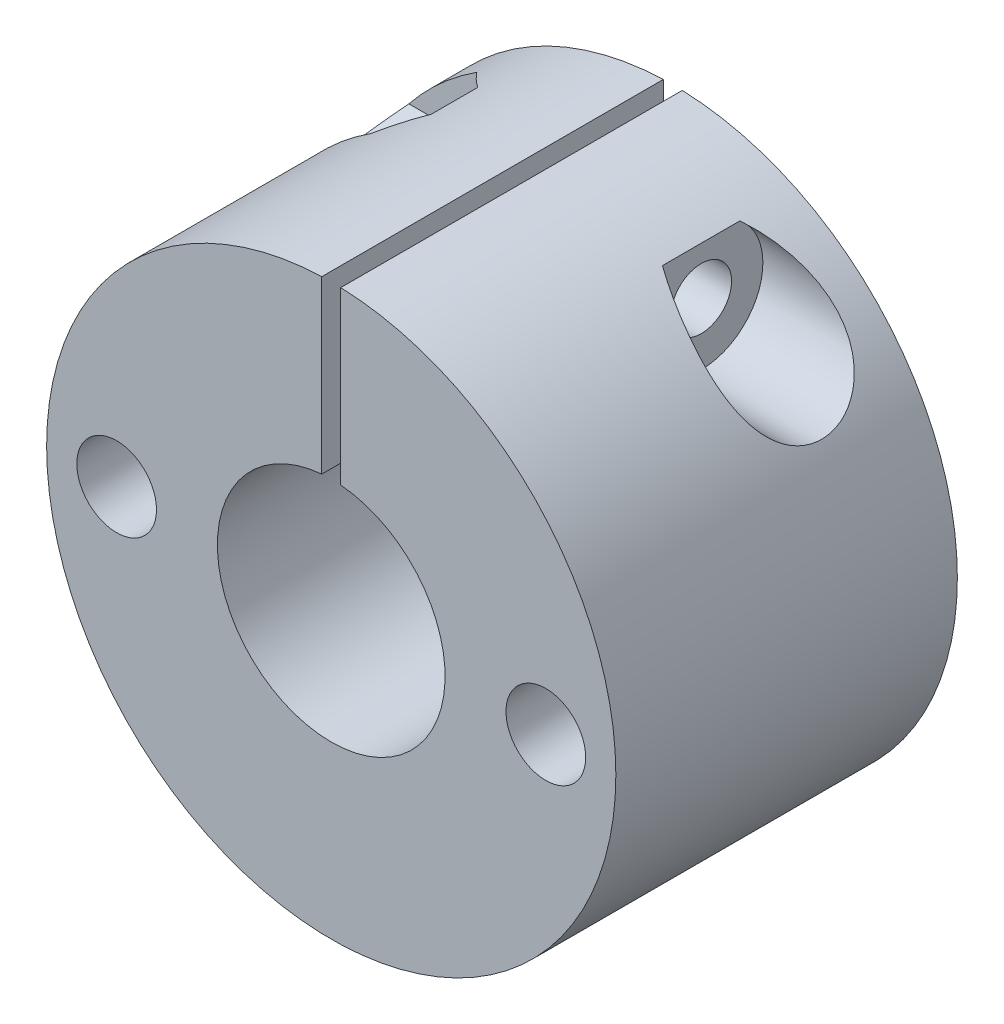
ISO-10303-21;
HEADER;
FILE_DESCRIPTION(('STEP AP214'),'2;1');
FILE_NAME('part.step','',(''),(''),'','','');
FILE_SCHEMA(('AUTOMOTIVE_DESIGN { 1 0 10303 214 1 1 1 1 }'));
ENDSEC;
DATA;
#1=APPLICATION_CONTEXT('core data for automotive mechanical design processes');
#2=APPLICATION_PROTOCOL_DEFINITION('international standard','automotive_design',2000,#1);
#3=PRODUCT_CONTEXT('',#1,'mechanical');
#4=PRODUCT('Part','Part','',(#3));
#5=PRODUCT_RELATED_PRODUCT_CATEGORY('part','',(#4));
#6=PRODUCT_DEFINITION_FORMATION('','',#4);
#7=PRODUCT_DEFINITION_CONTEXT('part definition',#1,'design');
#8=PRODUCT_DEFINITION('design','',#6,#7);
#9=PRODUCT_DEFINITION_SHAPE('','',#8);
#10=(LENGTH_UNIT() NAMED_UNIT(*) SI_UNIT(.MILLI.,.METRE.));
#11=(NAMED_UNIT(*) PLANE_ANGLE_UNIT() SI_UNIT($,.RADIAN.));
#12=(NAMED_UNIT(*) SI_UNIT($,.STERADIAN.) SOLID_ANGLE_UNIT());
#13=UNCERTAINTY_MEASURE_WITH_UNIT(LENGTH_MEASURE(1.E-05),#10,'distance_accuracy_value','');
#14=(GEOMETRIC_REPRESENTATION_CONTEXT(3) GLOBAL_UNCERTAINTY_ASSIGNED_CONTEXT((#13)) GLOBAL_UNIT_ASSIGNED_CONTEXT((#10,
#11,#12)) REPRESENTATION_CONTEXT('',''));
#15=CARTESIAN_POINT('',(0.,0.,0.));
#16=DIRECTION('',(0.,0.,1.));
#17=DIRECTION('',(1.,0.,0.));
#18=AXIS2_PLACEMENT_3D('',#15,#16,#17);
#19=CARTESIAN_POINT('',(0.,0.,10.));
#20=DIRECTION('',(0.,0.,-1.));
#21=DIRECTION('',(-1.,0.,0.));
#22=AXIS2_PLACEMENT_3D('',#19,#20,#21);
#23=CYLINDRICAL_SURFACE('',#22,15.);
#24=CARTESIAN_POINT('',(0.,0.,18.4381211149221));
#25=DIRECTION('',(0.,-0.866025403784439,-0.5));
#26=DIRECTION('',(0.,0.5,-0.866025403784439));
#27=AXIS2_PLACEMENT_3D('',#24,#25,#26);
#28=ELLIPSE('',#27,30.,15.);
#29=CARTESIAN_POINT('',(-12.8376646487421,7.75850284310304,5.));
#30=VERTEX_POINT('',#29);
#31=CARTESIAN_POINT('',(-11.7093043154738,9.375083596834,2.2));
#32=VERTEX_POINT('',#31);
#33=EDGE_CURVE('E41',#30,#32,#28,.T.);
#34=ORIENTED_EDGE('',*,*,#33,.T.);
#35=CARTESIAN_POINT('',(0.,0.,2.2));
#36=DIRECTION('',(0.,0.,-1.));
#37=DIRECTION('',(0.,1.,0.));
#38=AXIS2_PLACEMENT_3D('',#35,#36,#37);
#39=CIRCLE('',#38,15.);
#40=CARTESIAN_POINT('',(-8.12601719109666,12.6082451042959,2.2));
#41=VERTEX_POINT('',#40);
#42=EDGE_CURVE('E11',#32,#41,#39,.T.);
#43=ORIENTED_EDGE('',*,*,#42,.T.);
#44=CARTESIAN_POINT('',(0.,0.,-19.638121114922));
#45=DIRECTION('',(0.,0.866025403784438,-0.5));
#46=DIRECTION('',(0.,-0.5,-0.866025403784438));
#47=AXIS2_PLACEMENT_3D('',#44,#45,#46);
#48=ELLIPSE('',#47,30.,15.);
#49=CARTESIAN_POINT('',(-6.5,13.5185058345958,3.77661783301413));
#50=VERTEX_POINT('',#49);
#51=EDGE_CURVE('E221',#41,#50,#48,.T.);
#52=ORIENTED_EDGE('',*,*,#51,.T.);
#53=DIRECTION('',(0.,0.,-1.));
#54=VECTOR('',#53,1.);
#55=CARTESIAN_POINT('',(-6.5,13.5185058345958,10.));
#56=LINE('',#55,#54);
#57=CARTESIAN_POINT('',(-6.5,13.5185058345958,6.22338216698587));
#58=VERTEX_POINT('',#57);
#59=EDGE_CURVE('E186',#50,#58,#56,.F.);
#60=ORIENTED_EDGE('',*,*,#59,.T.);
#61=CARTESIAN_POINT('',(0.,0.,29.6381211149221));
#62=DIRECTION('',(0.,0.866025403784439,0.5));
#63=DIRECTION('',(0.,0.5,-0.866025403784439));
#64=AXIS2_PLACEMENT_3D('',#61,#62,#63);
#65=ELLIPSE('',#64,30.,15.);
#66=CARTESIAN_POINT('',(-8.12601719109666,12.6082451042959,7.8));
#67=VERTEX_POINT('',#66);
#68=EDGE_CURVE('E322',#58,#67,#65,.T.);
#69=ORIENTED_EDGE('',*,*,#68,.T.);
#70=CARTESIAN_POINT('',(0.,0.,7.8));
#71=DIRECTION('',(0.,0.,1.));
#72=DIRECTION('',(1.,0.,0.));
#73=AXIS2_PLACEMENT_3D('',#70,#71,#72);
#74=CIRCLE('',#73,15.);
#75=CARTESIAN_POINT('',(-11.7093043154738,9.375083596834,7.8));
#76=VERTEX_POINT('',#75);
#77=EDGE_CURVE('E320',#67,#76,#74,.T.);
#78=ORIENTED_EDGE('',*,*,#77,.T.);
#79=CARTESIAN_POINT('',(0.,0.,-8.43812111492206));
#80=DIRECTION('',(0.,-0.866025403784439,0.5));
#81=DIRECTION('',(0.,-0.5,-0.866025403784439));
#82=AXIS2_PLACEMENT_3D('',#79,#80,#81);
#83=ELLIPSE('',#82,30.,15.);
#84=EDGE_CURVE('E317',#76,#30,#83,.T.);
#85=ORIENTED_EDGE('',*,*,#84,.T.);
#86=EDGE_LOOP('',(#34,#43,#52,#60,#69,#78,#85));
#87=FACE_BOUND('',#86,.T.);
#88=DIRECTION('',(0.,0.,-1.));
#89=VECTOR('',#88,1.);
#90=CARTESIAN_POINT('',(6.5,13.5185058345958,10.));
#91=LINE('',#90,#89);
#92=CARTESIAN_POINT('',(6.5,13.5185058345958,7.04391098499443));
#93=VERTEX_POINT('',#92);
#94=CARTESIAN_POINT('',(6.5,13.5185058345958,2.95608901500557));
#95=VERTEX_POINT('',#94);
#96=EDGE_CURVE('E191',#93,#95,#91,.T.);
#97=ORIENTED_EDGE('',*,*,#96,.T.);
#98=CARTESIAN_POINT('',(6.5,13.5185058345958,2.95608901500557));
#99=CARTESIAN_POINT('',(6.60077995397167,13.4700535111463,2.89622151010847));
#100=CARTESIAN_POINT('',(6.70208644627659,13.4199509129455,2.8386018661959));
#101=CARTESIAN_POINT('',(6.90537761246059,13.3164834397401,2.72766532047725));
#102=CARTESIAN_POINT('',(7.00736223675518,13.2631188009656,2.67434810774526));
#103=CARTESIAN_POINT('',(7.21176967172565,13.1530937930471,2.57175450440019));
#104=CARTESIAN_POINT('',(7.31419285684764,13.0964296190281,2.52248294333907));
#105=CARTESIAN_POINT('',(7.51907997014724,12.9798818003815,2.42801287585828));
#106=CARTESIAN_POINT('',(7.62154389935371,12.9199980685512,2.38281447985034));
#107=CARTESIAN_POINT('',(7.93087980884181,12.7341821527837,2.25241462875838));
#108=CARTESIAN_POINT('',(8.13748046823632,12.603271592114,2.17351631200674));
#109=CARTESIAN_POINT('',(8.54801294702669,12.3285215546223,2.03368147863605));
#110=CARTESIAN_POINT('',(8.75194622040524,12.1846894891085,1.97273475039122));
#111=CARTESIAN_POINT('',(9.09464950279762,11.9297202200354,1.88635398124806));
#112=CARTESIAN_POINT('',(9.23452420221066,11.8218039504727,1.85575314665935));
#113=CARTESIAN_POINT('',(9.51155850133452,11.600074353212,1.80543189761769));
#114=CARTESIAN_POINT('',(9.64871819761472,11.4862612357806,1.78571109550228));
#115=CARTESIAN_POINT('',(9.91914441417635,11.2535442465628,1.75845874184467));
#116=CARTESIAN_POINT('',(10.0524224785325,11.1346587872467,1.75088641046633));
#117=CARTESIAN_POINT('',(10.3146370129245,10.892208616726,1.74925940827744));
#118=CARTESIAN_POINT('',(10.4435747735191,10.768645320081,1.7552006826105));
#119=CARTESIAN_POINT('',(10.755618397432,10.4587180957925,1.78863912334436));
#120=CARTESIAN_POINT('',(10.9357555610439,10.2700895295993,1.82494208798895));
#121=CARTESIAN_POINT('',(11.1942575585868,9.985247755581,1.9081723538056));
#122=CARTESIAN_POINT('',(11.2784667822413,9.88999319864192,1.94070726442509));
#123=CARTESIAN_POINT('',(11.4424690134127,9.69977649303123,2.01604234667242));
#124=CARTESIAN_POINT('',(11.522262971634,9.60481428560171,2.05884029777087));
#125=CARTESIAN_POINT('',(11.7217903474067,9.36144124043637,2.18346925330629));
#126=CARTESIAN_POINT('',(11.8378225033953,9.21400076758558,2.27353746119259));
#127=CARTESIAN_POINT('',(12.0003008380298,9.00005066507423,2.43020967027421));
#128=CARTESIAN_POINT('',(12.0525545534217,8.92990338353914,2.4860611308862));
#129=CARTESIAN_POINT('',(12.1528895219876,8.79286381422359,2.60500663394133));
#130=CARTESIAN_POINT('',(12.2009729065485,8.7259698714866,2.66809693797299));
#131=CARTESIAN_POINT('',(12.2930765080924,8.59573743607299,2.80208112197654));
#132=CARTESIAN_POINT('',(12.3370534804884,8.5324390531847,2.87304384628227));
#133=CARTESIAN_POINT('',(12.420073208734,8.41113430365239,3.02197551119575));
#134=CARTESIAN_POINT('',(12.4591185367247,8.35312518277624,3.09994076296406));
#135=CARTESIAN_POINT('',(12.5319846680426,8.24340338816984,3.26242479152513));
#136=CARTESIAN_POINT('',(12.5658076228899,8.19168812335837,3.34694084783836));
#137=CARTESIAN_POINT('',(12.6279825162501,8.09551355241083,3.5219033091721));
#138=CARTESIAN_POINT('',(12.6563355540382,8.05105278863401,3.61234851772082));
#139=CARTESIAN_POINT('',(12.7035494977617,7.97630758765642,3.78444792462952));
#140=CARTESIAN_POINT('',(12.7231954676874,7.94489777227231,3.86540046722918));
#141=CARTESIAN_POINT('',(12.7582694939701,7.88845131792142,4.03037739966574));
#142=CARTESIAN_POINT('',(12.7736981411689,7.86341378623954,4.1144013573293));
#143=CARTESIAN_POINT('',(12.8002512409679,7.8201162053009,4.28480626856938));
#144=CARTESIAN_POINT('',(12.8113777665728,7.80185289201702,4.37118606543489));
#145=CARTESIAN_POINT('',(12.8292808259275,7.77237668591578,4.54555568873136));
#146=CARTESIAN_POINT('',(12.8360576390547,7.76116334028763,4.6335454113851));
#147=CARTESIAN_POINT('',(12.8489029983896,7.73989863124004,4.88145406250534));
#148=CARTESIAN_POINT('',(12.850039900976,7.7379994857407,5.04243653087509));
#149=CARTESIAN_POINT('',(12.8380092992168,7.75793960802013,5.36225602170284));
#150=CARTESIAN_POINT('',(12.8248455755823,7.77977260164368,5.5210935999764));
#151=CARTESIAN_POINT('',(12.7848759859573,7.84527661894923,5.82882997558445));
#152=CARTESIAN_POINT('',(12.7583646062099,7.8884758952998,5.97786794159066));
#153=CARTESIAN_POINT('',(12.6922942070394,7.99434394350173,6.26574334892559));
#154=CARTESIAN_POINT('',(12.6527343262246,8.05701400069324,6.40458011608607));
#155=CARTESIAN_POINT('',(12.5595115615957,8.20160417448285,6.67401069625711));
#156=CARTESIAN_POINT('',(12.505373343997,8.28416078485868,6.80409663014154));
#157=CARTESIAN_POINT('',(12.3847807615201,8.46338317364435,7.04772867073237));
#158=CARTESIAN_POINT('',(12.318322794249,8.56005307713249,7.16126992225306));
#159=CARTESIAN_POINT('',(12.1672280235717,8.77366967281356,7.38090691962466));
#160=CARTESIAN_POINT('',(12.0814470729571,8.89167529816192,7.48517744856051));
#161=CARTESIAN_POINT('',(11.8982014038141,9.13542815515895,7.67217476194751));
#162=CARTESIAN_POINT('',(11.8007296508007,9.26118002545131,7.75488847950088));
#163=CARTESIAN_POINT('',(11.6234496914707,9.48207761270871,7.88013402847819));
#164=CARTESIAN_POINT('',(11.5459211060164,9.57638032348254,7.92749224798169));
#165=CARTESIAN_POINT('',(11.3861854048312,9.76576255074424,8.01171118578004));
#166=CARTESIAN_POINT('',(11.3039766465506,9.86084232979945,8.04856819098562));
#167=CARTESIAN_POINT('',(11.1354125672287,10.0508078215784,8.11245023206344));
#168=CARTESIAN_POINT('',(11.0490524331475,10.1456931692477,8.13946352813617));
#169=CARTESIAN_POINT('',(10.8727972195146,10.3343582909763,8.18431362944683));
#170=CARTESIAN_POINT('',(10.7829011672122,10.4281377514458,8.20214789020409));
#171=CARTESIAN_POINT('',(10.5650919347078,10.6494725449636,8.23454112014992));
#172=CARTESIAN_POINT('',(10.4357866377049,10.7762302326248,8.24523963300513));
#173=CARTESIAN_POINT('',(10.1724566573497,11.0251529418463,8.25221339378782));
#174=CARTESIAN_POINT('',(10.0384303089628,11.1473163110161,8.2484835015585));
#175=CARTESIAN_POINT('',(9.76608785967312,11.3866815714186,8.22814862174923));
#176=CARTESIAN_POINT('',(9.62775731060085,11.5038626963075,8.21149443852779));
#177=CARTESIAN_POINT('',(9.34810684919636,11.7322423858804,8.16663627051442));
#178=CARTESIAN_POINT('',(9.20678684807925,11.8434407725323,8.1384319422322));
#179=CARTESIAN_POINT('',(8.85390671956257,12.1110698671338,8.05570740568714));
#180=CARTESIAN_POINT('',(8.64096599176621,12.2638042398071,7.99505155251428));
#181=CARTESIAN_POINT('',(8.21189406901484,12.5551624555191,7.85380792640738));
#182=CARTESIAN_POINT('',(7.99576070078221,12.6937761267096,7.77320592659775));
#183=CARTESIAN_POINT('',(7.6721871459187,12.8900432592521,7.6390938181006));
#184=CARTESIAN_POINT('',(7.56511092058473,12.9531591330083,7.59252449729816));
#185=CARTESIAN_POINT('',(7.35096505679336,13.0758761437704,7.49493639288319));
#186=CARTESIAN_POINT('',(7.24389541823547,13.1354773791167,7.44391773386344));
#187=CARTESIAN_POINT('',(7.03023226470404,13.2510585617706,7.33748017667258));
#188=CARTESIAN_POINT('',(6.92363827901506,13.3070437505683,7.28206791916836));
#189=CARTESIAN_POINT('',(6.71117235021071,13.4154549932104,7.16655740792555));
#190=CARTESIAN_POINT('',(6.60530045912946,13.4678807929526,7.10645882028998));
#191=CARTESIAN_POINT('',(6.49999999999974,13.5185058345959,7.04391098499603));
#192=B_SPLINE_CURVE_WITH_KNOTS('',3,(#98,#99,#100,#101,#102,#103,#104,#105,#106,#107,#108,#109,
#110,#111,#112,#113,#114,#115,#116,#117,#118,#119,#120,#121,#122,#123,#124,#125,#126,#127,#128,
#129,#130,#131,#132,#133,#134,#135,#136,#137,#138,#139,#140,#141,#142,#143,#144,#145,#146,#147,
#148,#149,#150,#151,#152,#153,#154,#155,#156,#157,#158,#159,#160,#161,#162,#163,#164,#165,#166,
#167,#168,#169,#170,#171,#172,#173,#174,#175,#176,#177,#178,#179,#180,#181,#182,#183,#184,#185,
#186,#187,#188,#189,#190,#191),.UNSPECIFIED.,.F.,.F.,(4,2,2,2,2,2,2,2,2,2,2,2,2,2,2,2,2,2,2,2,2,
2,2,2,2,2,2,2,2,2,2,2,2,2,2,2,2,2,2,2,2,2,2,2,2,2,4),(0.,0.380469307460688,0.760911094689918,
1.14180062925206,1.52270048552397,2.29271460233827,3.06228985273649,3.59978439050786,
4.13725977577012,4.67292716660796,5.20843384772543,5.99519145562376,6.38849513697244,
6.78171379910472,7.40317447686845,7.71420740408708,8.02508041910718,8.33892576644932,
8.65260674316072,8.96615814236348,9.27964646215907,9.5463639396275,9.81304403113572,
10.0795954605276,10.3461297678981,10.8265336849873,11.3068106267623,11.776927461797,
12.2470753376248,12.7349425728362,13.2229526899802,13.7588716623548,14.2951147362835,
14.6874488599373,15.0799215360308,15.4728607625287,15.8659088554232,16.4092605180387,
16.9528057689203,17.4984302061521,18.0440708709123,18.8497245157184,19.6559544692675,
20.0540505212815,20.4521354291707,20.8496297228535,21.2471523635839),.UNSPECIFIED.);
#193=EDGE_CURVE('E209',#95,#93,#192,.T.);
#194=ORIENTED_EDGE('',*,*,#193,.T.);
#195=EDGE_LOOP('',(#97,#194));
#196=FACE_BOUND('',#195,.T.);
#197=CARTESIAN_POINT('',(0.,0.,0.));
#198=DIRECTION('',(0.,0.,1.));
#199=DIRECTION('',(1.,0.,0.));
#200=AXIS2_PLACEMENT_3D('',#197,#198,#199);
#201=CIRCLE('',#200,15.);
#202=CARTESIAN_POINT('',(-0.5,14.9916643505649,0.));
#203=VERTEX_POINT('',#202);
#204=CARTESIAN_POINT('',(0.5,14.9916643505649,0.));
#205=VERTEX_POINT('',#204);
#206=EDGE_CURVE('E123',#203,#205,#201,.T.);
#207=ORIENTED_EDGE('',*,*,#206,.T.);
#208=DIRECTION('',(0.,0.,-1.));
#209=VECTOR('',#208,1.);
#210=CARTESIAN_POINT('',(0.5,14.9916643505649,10.));
#211=LINE('',#210,#209);
#212=CARTESIAN_POINT('',(0.5,14.9916643505649,18.));
#213=VERTEX_POINT('',#212);
#214=EDGE_CURVE('E117',#213,#205,#211,.T.);
#215=ORIENTED_EDGE('',*,*,#214,.F.);
#216=CARTESIAN_POINT('',(0.,0.,18.));
#217=DIRECTION('',(0.,0.,1.));
#218=DIRECTION('',(1.,0.,0.));
#219=AXIS2_PLACEMENT_3D('',#216,#217,#218);
#220=CIRCLE('',#219,15.);
#221=CARTESIAN_POINT('',(-0.5,14.9916643505649,18.));
#222=VERTEX_POINT('',#221);
#223=EDGE_CURVE('E121',#222,#213,#220,.T.);
#224=ORIENTED_EDGE('',*,*,#223,.F.);
#225=DIRECTION('',(0.,0.,-1.));
#226=VECTOR('',#225,1.);
#227=CARTESIAN_POINT('',(-0.5,14.9916643505649,10.));
#228=LINE('',#227,#226);
#229=EDGE_CURVE('E127',#203,#222,#228,.F.);
#230=ORIENTED_EDGE('',*,*,#229,.F.);
#231=EDGE_LOOP('',(#207,#215,#224,#230));
#232=FACE_BOUND('',#231,.T.);
#233=ADVANCED_FACE('F33',(#87,#196,#232),#23,.T.);
#234=CARTESIAN_POINT('',(0.,0.,0.));
#235=DIRECTION('',(0.,0.,1.));
#236=DIRECTION('',(1.,0.,0.));
#237=AXIS2_PLACEMENT_3D('',#234,#235,#236);
#238=PLANE('',#237);
#239=CARTESIAN_POINT('',(11.31,0.,0.));
#240=DIRECTION('',(0.,0.,1.));
#241=DIRECTION('',(1.,0.,0.));
#242=AXIS2_PLACEMENT_3D('',#239,#240,#241);
#243=CIRCLE('',#242,2.1);
#244=CARTESIAN_POINT('',(13.41,0.,0.));
#245=VERTEX_POINT('',#244);
#246=EDGE_CURVE('E154',#245,#245,#243,.F.);
#247=ORIENTED_EDGE('',*,*,#246,.F.);
#248=EDGE_LOOP('',(#247));
#249=FACE_BOUND('',#248,.T.);
#250=CARTESIAN_POINT('',(-11.31,0.,0.));
#251=DIRECTION('',(0.,0.,1.));
#252=DIRECTION('',(1.,0.,0.));
#253=AXIS2_PLACEMENT_3D('',#250,#251,#252);
#254=CIRCLE('',#253,2.1);
#255=CARTESIAN_POINT('',(-9.21,0.,0.));
#256=VERTEX_POINT('',#255);
#257=EDGE_CURVE('E153',#256,#256,#254,.F.);
#258=ORIENTED_EDGE('',*,*,#257,.F.);
#259=EDGE_LOOP('',(#258));
#260=FACE_BOUND('',#259,.T.);
#261=CARTESIAN_POINT('',(0.,0.,0.));
#262=DIRECTION('',(0.,0.,1.));
#263=DIRECTION('',(1.,0.,0.));
#264=AXIS2_PLACEMENT_3D('',#261,#262,#263);
#265=CIRCLE('',#264,6.);
#266=CARTESIAN_POINT('',(-0.499999999999999,5.9791303715507,0.));
#267=VERTEX_POINT('',#266);
#268=CARTESIAN_POINT('',(0.500000000000001,5.9791303715507,0.));
#269=VERTEX_POINT('',#268);
#270=EDGE_CURVE('E205',#267,#269,#265,.T.);
#271=ORIENTED_EDGE('',*,*,#270,.T.);
#272=DIRECTION('',(0.,-1.,0.));
#273=VECTOR('',#272,1.);
#274=CARTESIAN_POINT('',(0.5,18.,0.));
#275=LINE('',#274,#273);
#276=EDGE_CURVE('E126',#205,#269,#275,.T.);
#277=ORIENTED_EDGE('',*,*,#276,.F.);
#278=ORIENTED_EDGE('',*,*,#206,.F.);
#279=DIRECTION('',(0.,1.,0.));
#280=VECTOR('',#279,1.);
#281=CARTESIAN_POINT('',(-0.5,18.,0.));
#282=LINE('',#281,#280);
#283=EDGE_CURVE('E203',#267,#203,#282,.T.);
#284=ORIENTED_EDGE('',*,*,#283,.F.);
#285=EDGE_LOOP('',(#271,#277,#278,#284));
#286=FACE_BOUND('',#285,.T.);
#287=ADVANCED_FACE('F245',(#249,#260,#286),#238,.F.);
#288=CARTESIAN_POINT('',(0.,0.,10.));
#289=DIRECTION('',(0.,0.,-1.));
#290=DIRECTION('',(-1.,0.,0.));
#291=AXIS2_PLACEMENT_3D('',#288,#289,#290);
#292=CYLINDRICAL_SURFACE('',#291,6.);
#293=DIRECTION('',(0.,0.,-1.));
#294=VECTOR('',#293,1.);
#295=CARTESIAN_POINT('',(0.500000000000001,5.9791303715507,10.));
#296=LINE('',#295,#294);
#297=CARTESIAN_POINT('',(0.500000000000001,5.9791303715507,18.));
#298=VERTEX_POINT('',#297);
#299=EDGE_CURVE('E133',#298,#269,#296,.T.);
#300=ORIENTED_EDGE('',*,*,#299,.T.);
#301=ORIENTED_EDGE('',*,*,#270,.F.);
#302=DIRECTION('',(0.,0.,-1.));
#303=VECTOR('',#302,1.);
#304=CARTESIAN_POINT('',(-0.499999999999999,5.9791303715507,10.));
#305=LINE('',#304,#303);
#306=CARTESIAN_POINT('',(-0.499999999999998,5.9791303715507,18.));
#307=VERTEX_POINT('',#306);
#308=EDGE_CURVE('E198',#267,#307,#305,.F.);
#309=ORIENTED_EDGE('',*,*,#308,.T.);
#310=CARTESIAN_POINT('',(0.,0.,18.));
#311=DIRECTION('',(0.,0.,-1.));
#312=DIRECTION('',(1.,0.,0.));
#313=AXIS2_PLACEMENT_3D('',#310,#311,#312);
#314=CIRCLE('',#313,6.);
#315=EDGE_CURVE('E137',#298,#307,#314,.T.);
#316=ORIENTED_EDGE('',*,*,#315,.F.);
#317=EDGE_LOOP('',(#300,#301,#309,#316));
#318=FACE_BOUND('',#317,.T.);
#319=ADVANCED_FACE('F239',(#318),#292,.F.);
#320=CARTESIAN_POINT('',(-0.5,18.,-0.000999999999999265));
#321=DIRECTION('',(-1.,0.,0.));
#322=DIRECTION('',(0.,-1.,0.));
#323=AXIS2_PLACEMENT_3D('',#320,#321,#322);
#324=PLANE('',#323);
#325=CARTESIAN_POINT('',(-0.5,10.9916643505649,5.));
#326=DIRECTION('',(-1.,0.,0.));
#327=DIRECTION('',(0.,-1.,0.));
#328=AXIS2_PLACEMENT_3D('',#325,#326,#327);
#329=CIRCLE('',#328,1.6);
#330=CARTESIAN_POINT('',(-0.5,9.39166435056495,5.));
#331=VERTEX_POINT('',#330);
#332=EDGE_CURVE('E195',#331,#331,#329,.F.);
#333=ORIENTED_EDGE('',*,*,#332,.F.);
#334=EDGE_LOOP('',(#333));
#335=FACE_BOUND('',#334,.T.);
#336=ORIENTED_EDGE('',*,*,#229,.T.);
#337=DIRECTION('',(0.,1.,0.));
#338=VECTOR('',#337,1.);
#339=CARTESIAN_POINT('',(-0.499999999999998,5.9791303715507,18.));
#340=LINE('',#339,#338);
#341=EDGE_CURVE('E143',#307,#222,#340,.T.);
#342=ORIENTED_EDGE('',*,*,#341,.F.);
#343=ORIENTED_EDGE('',*,*,#308,.F.);
#344=ORIENTED_EDGE('',*,*,#283,.T.);
#345=EDGE_LOOP('',(#336,#342,#343,#344));
#346=FACE_BOUND('',#345,.T.);
#347=ADVANCED_FACE('F236',(#335,#346),#324,.F.);
#348=CARTESIAN_POINT('',(0.5,18.,-0.000999999999999265));
#349=DIRECTION('',(1.,0.,0.));
#350=DIRECTION('',(0.,1.,0.));
#351=AXIS2_PLACEMENT_3D('',#348,#349,#350);
#352=PLANE('',#351);
#353=CARTESIAN_POINT('',(0.5,10.9916643505649,5.));
#354=DIRECTION('',(1.,0.,0.));
#355=DIRECTION('',(0.,1.,0.));
#356=AXIS2_PLACEMENT_3D('',#353,#354,#355);
#357=CIRCLE('',#356,1.6);
#358=CARTESIAN_POINT('',(0.5,12.5916643505649,5.));
#359=VERTEX_POINT('',#358);
#360=EDGE_CURVE('E194',#359,#359,#357,.F.);
#361=ORIENTED_EDGE('',*,*,#360,.F.);
#362=EDGE_LOOP('',(#361));
#363=FACE_BOUND('',#362,.T.);
#364=ORIENTED_EDGE('',*,*,#214,.T.);
#365=ORIENTED_EDGE('',*,*,#276,.T.);
#366=ORIENTED_EDGE('',*,*,#299,.F.);
#367=DIRECTION('',(0.,-1.,0.));
#368=VECTOR('',#367,1.);
#369=CARTESIAN_POINT('',(0.5,14.9916643505649,18.));
#370=LINE('',#369,#368);
#371=EDGE_CURVE('E130',#213,#298,#370,.T.);
#372=ORIENTED_EDGE('',*,*,#371,.F.);
#373=EDGE_LOOP('',(#364,#365,#366,#372));
#374=FACE_BOUND('',#373,.T.);
#375=ADVANCED_FACE('F131',(#363,#374),#352,.F.);
#376=CARTESIAN_POINT('',(-29.5,10.9916643505649,5.));
#377=DIRECTION('',(1.,0.,0.));
#378=DIRECTION('',(0.,1.,0.));
#379=AXIS2_PLACEMENT_3D('',#376,#377,#378);
#380=CYLINDRICAL_SURFACE('',#379,1.6);
#381=CARTESIAN_POINT('',(6.5,10.9916643505649,5.));
#382=DIRECTION('',(-1.,0.,0.));
#383=DIRECTION('',(0.,-1.,0.));
#384=AXIS2_PLACEMENT_3D('',#381,#382,#383);
#385=CIRCLE('',#384,1.6);
#386=CARTESIAN_POINT('',(6.5,9.39166435056495,5.));
#387=VERTEX_POINT('',#386);
#388=EDGE_CURVE('E190',#387,#387,#385,.T.);
#389=ORIENTED_EDGE('',*,*,#388,.F.);
#390=EDGE_LOOP('',(#389));
#391=FACE_BOUND('',#390,.T.);
#392=ORIENTED_EDGE('',*,*,#360,.T.);
#393=EDGE_LOOP('',(#392));
#394=FACE_BOUND('',#393,.T.);
#395=ADVANCED_FACE('F234',(#391,#394),#380,.F.);
#396=CARTESIAN_POINT('',(-6.5,10.9916643505649,5.));
#397=DIRECTION('',(1.,0.,0.));
#398=DIRECTION('',(0.,1.,0.));
#399=AXIS2_PLACEMENT_3D('',#396,#397,#398);
#400=CIRCLE('',#399,1.6);
#401=CARTESIAN_POINT('',(-6.5,12.5916643505649,5.));
#402=VERTEX_POINT('',#401);
#403=EDGE_CURVE('E178',#402,#402,#400,.T.);
#404=ORIENTED_EDGE('',*,*,#403,.F.);
#405=EDGE_LOOP('',(#404));
#406=FACE_BOUND('',#405,.T.);
#407=ORIENTED_EDGE('',*,*,#332,.T.);
#408=EDGE_LOOP('',(#407));
#409=FACE_BOUND('',#408,.T.);
#410=ADVANCED_FACE('F229',(#406,#409),#380,.F.);
#411=CARTESIAN_POINT('',(36.5,10.991664350565,5.));
#412=DIRECTION('',(-1.,0.,0.));
#413=DIRECTION('',(0.,-1.,0.));
#414=AXIS2_PLACEMENT_3D('',#411,#412,#413);
#415=CYLINDRICAL_SURFACE('',#414,3.25);
#416=CARTESIAN_POINT('',(6.5,10.9916643505649,5.));
#417=DIRECTION('',(-1.,0.,0.));
#418=DIRECTION('',(0.,-1.,0.));
#419=AXIS2_PLACEMENT_3D('',#416,#417,#418);
#420=CIRCLE('',#419,3.25);
#421=EDGE_CURVE('E55',#95,#93,#420,.T.);
#422=ORIENTED_EDGE('',*,*,#421,.T.);
#423=ORIENTED_EDGE('',*,*,#193,.F.);
#424=EDGE_LOOP('',(#422,#423));
#425=FACE_BOUND('',#424,.T.);
#426=ADVANCED_FACE('F223',(#425),#415,.F.);
#427=CARTESIAN_POINT('',(6.5,10.9916643505649,5.));
#428=DIRECTION('',(-1.,0.,0.));
#429=DIRECTION('',(0.,-1.,0.));
#430=AXIS2_PLACEMENT_3D('',#427,#428,#429);
#431=PLANE('',#430);
#432=ORIENTED_EDGE('',*,*,#388,.T.);
#433=EDGE_LOOP('',(#432));
#434=FACE_BOUND('',#433,.T.);
#435=ORIENTED_EDGE('',*,*,#421,.F.);
#436=ORIENTED_EDGE('',*,*,#96,.F.);
#437=EDGE_LOOP('',(#435,#436));
#438=FACE_BOUND('',#437,.T.);
#439=ADVANCED_FACE('F228',(#434,#438),#431,.F.);
#440=CARTESIAN_POINT('',(-36.5,7.75850284310304,5.));
#441=DIRECTION('',(0.,-0.866025403784439,-0.5));
#442=DIRECTION('',(0.,0.5,-0.866025403784439));
#443=AXIS2_PLACEMENT_3D('',#440,#441,#442);
#444=PLANE('',#443);
#445=DIRECTION('',(1.,0.,0.));
#446=VECTOR('',#445,1.);
#447=CARTESIAN_POINT('',(-36.5,7.75850284310304,5.));
#448=LINE('',#447,#446);
#449=CARTESIAN_POINT('',(-6.5,7.75850284310305,5.));
#450=VERTEX_POINT('',#449);
#451=EDGE_CURVE('E176',#30,#450,#448,.T.);
#452=ORIENTED_EDGE('',*,*,#451,.T.);
#453=DIRECTION('',(0.,0.5,-0.866025403784438));
#454=VECTOR('',#453,1.);
#455=CARTESIAN_POINT('',(-6.5,7.75850284310305,5.));
#456=LINE('',#455,#454);
#457=CARTESIAN_POINT('',(-6.5,9.375083596834,2.2));
#458=VERTEX_POINT('',#457);
#459=EDGE_CURVE('E157',#450,#458,#456,.T.);
#460=ORIENTED_EDGE('',*,*,#459,.T.);
#461=DIRECTION('',(1.,0.,0.));
#462=VECTOR('',#461,1.);
#463=CARTESIAN_POINT('',(-36.5,9.375083596834,2.2));
#464=LINE('',#463,#462);
#465=EDGE_CURVE('E175',#32,#458,#464,.T.);
#466=ORIENTED_EDGE('',*,*,#465,.F.);
#467=ORIENTED_EDGE('',*,*,#33,.F.);
#468=EDGE_LOOP('',(#452,#460,#466,#467));
#469=FACE_BOUND('',#468,.T.);
#470=ADVANCED_FACE('F287',(#469),#444,.F.);
#471=CARTESIAN_POINT('',(-36.5,9.37508359683399,7.8));
#472=DIRECTION('',(0.,-0.866025403784439,0.5));
#473=DIRECTION('',(0.,-0.5,-0.866025403784439));
#474=AXIS2_PLACEMENT_3D('',#471,#472,#473);
#475=PLANE('',#474);
#476=DIRECTION('',(1.,0.,0.));
#477=VECTOR('',#476,1.);
#478=CARTESIAN_POINT('',(-36.5,9.37508359683399,7.8));
#479=LINE('',#478,#477);
#480=CARTESIAN_POINT('',(-6.5,9.375083596834,7.8));
#481=VERTEX_POINT('',#480);
#482=EDGE_CURVE('E179',#76,#481,#479,.T.);
#483=ORIENTED_EDGE('',*,*,#482,.T.);
#484=DIRECTION('',(0.,-0.5,-0.866025403784439));
#485=VECTOR('',#484,1.);
#486=CARTESIAN_POINT('',(-6.5,9.375083596834,7.8));
#487=LINE('',#486,#485);
#488=EDGE_CURVE('E172',#481,#450,#487,.T.);
#489=ORIENTED_EDGE('',*,*,#488,.T.);
#490=ORIENTED_EDGE('',*,*,#451,.F.);
#491=ORIENTED_EDGE('',*,*,#84,.F.);
#492=EDGE_LOOP('',(#483,#489,#490,#491));
#493=FACE_BOUND('',#492,.T.);
#494=ADVANCED_FACE('F283',(#493),#475,.F.);
#495=CARTESIAN_POINT('',(-36.5,12.6082451042959,7.8));
#496=DIRECTION('',(0.,0.,1.));
#497=DIRECTION('',(1.,0.,0.));
#498=AXIS2_PLACEMENT_3D('',#495,#496,#497);
#499=PLANE('',#498);
#500=DIRECTION('',(1.,0.,0.));
#501=VECTOR('',#500,1.);
#502=CARTESIAN_POINT('',(-36.5,12.6082451042959,7.8));
#503=LINE('',#502,#501);
#504=CARTESIAN_POINT('',(-6.5,12.6082451042959,7.8));
#505=VERTEX_POINT('',#504);
#506=EDGE_CURVE('E181',#67,#505,#503,.T.);
#507=ORIENTED_EDGE('',*,*,#506,.T.);
#508=DIRECTION('',(0.,-1.,0.));
#509=VECTOR('',#508,1.);
#510=CARTESIAN_POINT('',(-6.5,12.6082451042959,7.8));
#511=LINE('',#510,#509);
#512=EDGE_CURVE('E169',#505,#481,#511,.T.);
#513=ORIENTED_EDGE('',*,*,#512,.T.);
#514=ORIENTED_EDGE('',*,*,#482,.F.);
#515=ORIENTED_EDGE('',*,*,#77,.F.);
#516=EDGE_LOOP('',(#507,#513,#514,#515));
#517=FACE_BOUND('',#516,.T.);
#518=ADVANCED_FACE('F286',(#517),#499,.F.);
#519=CARTESIAN_POINT('',(-36.5,14.2248258580269,5.));
#520=DIRECTION('',(0.,0.866025403784439,0.5));
#521=DIRECTION('',(0.,-0.5,0.866025403784439));
#522=AXIS2_PLACEMENT_3D('',#519,#520,#521);
#523=PLANE('',#522);
#524=DIRECTION('',(0.,-0.5,0.866025403784439));
#525=VECTOR('',#524,1.);
#526=CARTESIAN_POINT('',(-6.5,14.2248258580269,5.));
#527=LINE('',#526,#525);
#528=EDGE_CURVE('E48',#58,#505,#527,.T.);
#529=ORIENTED_EDGE('',*,*,#528,.T.);
#530=ORIENTED_EDGE('',*,*,#506,.F.);
#531=ORIENTED_EDGE('',*,*,#68,.F.);
#532=EDGE_LOOP('',(#529,#530,#531));
#533=FACE_BOUND('',#532,.T.);
#534=ADVANCED_FACE('F291',(#533),#523,.F.);
#535=CARTESIAN_POINT('',(-36.5,12.6082451042959,2.2));
#536=DIRECTION('',(0.,0.866025403784438,-0.5));
#537=DIRECTION('',(0.,0.5,0.866025403784438));
#538=AXIS2_PLACEMENT_3D('',#535,#536,#537);
#539=PLANE('',#538);
#540=DIRECTION('',(1.,0.,0.));
#541=VECTOR('',#540,1.);
#542=CARTESIAN_POINT('',(-36.5,12.6082451042959,2.2));
#543=LINE('',#542,#541);
#544=CARTESIAN_POINT('',(-6.5,12.6082451042959,2.2));
#545=VERTEX_POINT('',#544);
#546=EDGE_CURVE('E183',#41,#545,#543,.T.);
#547=ORIENTED_EDGE('',*,*,#546,.T.);
#548=DIRECTION('',(0.,0.5,0.866025403784438));
#549=VECTOR('',#548,1.);
#550=CARTESIAN_POINT('',(-6.5,12.6082451042959,2.2));
#551=LINE('',#550,#549);
#552=EDGE_CURVE('E165',#545,#50,#551,.T.);
#553=ORIENTED_EDGE('',*,*,#552,.T.);
#554=ORIENTED_EDGE('',*,*,#51,.F.);
#555=EDGE_LOOP('',(#547,#553,#554));
#556=FACE_BOUND('',#555,.T.);
#557=ADVANCED_FACE('F295',(#556),#539,.F.);
#558=CARTESIAN_POINT('',(-36.5,9.375083596834,2.2));
#559=DIRECTION('',(0.,0.,-1.));
#560=DIRECTION('',(0.,1.,0.));
#561=AXIS2_PLACEMENT_3D('',#558,#559,#560);
#562=PLANE('',#561);
#563=ORIENTED_EDGE('',*,*,#465,.T.);
#564=DIRECTION('',(0.,1.,0.));
#565=VECTOR('',#564,1.);
#566=CARTESIAN_POINT('',(-6.5,9.375083596834,2.2));
#567=LINE('',#566,#565);
#568=EDGE_CURVE('E162',#458,#545,#567,.T.);
#569=ORIENTED_EDGE('',*,*,#568,.T.);
#570=ORIENTED_EDGE('',*,*,#546,.F.);
#571=ORIENTED_EDGE('',*,*,#42,.F.);
#572=EDGE_LOOP('',(#563,#569,#570,#571));
#573=FACE_BOUND('',#572,.T.);
#574=ADVANCED_FACE('F281',(#573),#562,.F.);
#575=CARTESIAN_POINT('',(-6.5,0.,0.));
#576=DIRECTION('',(1.,0.,0.));
#577=DIRECTION('',(0.,1.,0.));
#578=AXIS2_PLACEMENT_3D('',#575,#576,#577);
#579=PLANE('',#578);
#580=ORIENTED_EDGE('',*,*,#403,.T.);
#581=EDGE_LOOP('',(#580));
#582=FACE_BOUND('',#581,.T.);
#583=ORIENTED_EDGE('',*,*,#552,.F.);
#584=ORIENTED_EDGE('',*,*,#568,.F.);
#585=ORIENTED_EDGE('',*,*,#459,.F.);
#586=ORIENTED_EDGE('',*,*,#488,.F.);
#587=ORIENTED_EDGE('',*,*,#512,.F.);
#588=ORIENTED_EDGE('',*,*,#528,.F.);
#589=ORIENTED_EDGE('',*,*,#59,.F.);
#590=EDGE_LOOP('',(#583,#584,#585,#586,#587,#588,#589));
#591=FACE_BOUND('',#590,.T.);
#592=ADVANCED_FACE('F265',(#582,#591),#579,.F.);
#593=CARTESIAN_POINT('',(-11.31,0.,-0.000999999999999265));
#594=DIRECTION('',(0.,0.,1.));
#595=DIRECTION('',(1.,0.,0.));
#596=AXIS2_PLACEMENT_3D('',#593,#594,#595);
#597=CYLINDRICAL_SURFACE('',#596,2.1);
#598=ORIENTED_EDGE('',*,*,#257,.T.);
#599=EDGE_LOOP('',(#598));
#600=FACE_BOUND('',#599,.T.);
#601=CARTESIAN_POINT('',(-11.31,0.,18.));
#602=DIRECTION('',(0.,0.,1.));
#603=DIRECTION('',(1.,0.,0.));
#604=AXIS2_PLACEMENT_3D('',#601,#602,#603);
#605=CIRCLE('',#604,2.1);
#606=CARTESIAN_POINT('',(-9.21,0.,18.));
#607=VERTEX_POINT('',#606);
#608=EDGE_CURVE('E147',#607,#607,#605,.T.);
#609=ORIENTED_EDGE('',*,*,#608,.T.);
#610=EDGE_LOOP('',(#609));
#611=FACE_BOUND('',#610,.T.);
#612=ADVANCED_FACE('F261',(#600,#611),#597,.F.);
#613=CARTESIAN_POINT('',(11.31,0.,-0.000999999999999265));
#614=DIRECTION('',(0.,0.,1.));
#615=DIRECTION('',(1.,0.,0.));
#616=AXIS2_PLACEMENT_3D('',#613,#614,#615);
#617=CYLINDRICAL_SURFACE('',#616,2.1);
#618=ORIENTED_EDGE('',*,*,#246,.T.);
#619=EDGE_LOOP('',(#618));
#620=FACE_BOUND('',#619,.T.);
#621=CARTESIAN_POINT('',(11.31,0.,18.));
#622=DIRECTION('',(0.,0.,1.));
#623=DIRECTION('',(1.,0.,0.));
#624=AXIS2_PLACEMENT_3D('',#621,#622,#623);
#625=CIRCLE('',#624,2.1);
#626=CARTESIAN_POINT('',(13.41,0.,18.));
#627=VERTEX_POINT('',#626);
#628=EDGE_CURVE('E144',#627,#627,#625,.T.);
#629=ORIENTED_EDGE('',*,*,#628,.T.);
#630=EDGE_LOOP('',(#629));
#631=FACE_BOUND('',#630,.T.);
#632=ADVANCED_FACE('F264',(#620,#631),#617,.F.);
#633=CARTESIAN_POINT('',(0.,0.,18.));
#634=DIRECTION('',(0.,0.,1.));
#635=DIRECTION('',(1.,0.,0.));
#636=AXIS2_PLACEMENT_3D('',#633,#634,#635);
#637=PLANE('',#636);
#638=ORIENTED_EDGE('',*,*,#628,.F.);
#639=EDGE_LOOP('',(#638));
#640=FACE_BOUND('',#639,.T.);
#641=ORIENTED_EDGE('',*,*,#223,.T.);
#642=ORIENTED_EDGE('',*,*,#371,.T.);
#643=ORIENTED_EDGE('',*,*,#315,.T.);
#644=ORIENTED_EDGE('',*,*,#341,.T.);
#645=EDGE_LOOP('',(#641,#642,#643,#644));
#646=FACE_BOUND('',#645,.T.);
#647=ORIENTED_EDGE('',*,*,#608,.F.);
#648=EDGE_LOOP('',(#647));
#649=FACE_BOUND('',#648,.T.);
#650=ADVANCED_FACE('F140',(#640,#646,#649),#637,.T.);
#651=CLOSED_SHELL('',(#233,#287,#319,#347,#375,#395,#410,#426,#439,#470,#494,#518,#534,#557,
#574,#592,#612,#632,#650));
#652=MANIFOLD_SOLID_BREP('B2',#651);
#653=ADVANCED_BREP_SHAPE_REPRESENTATION('',(#18,#652),#14);
#654=SHAPE_DEFINITION_REPRESENTATION(#9,#653);
ENDSEC;
END-ISO-10303-21;
